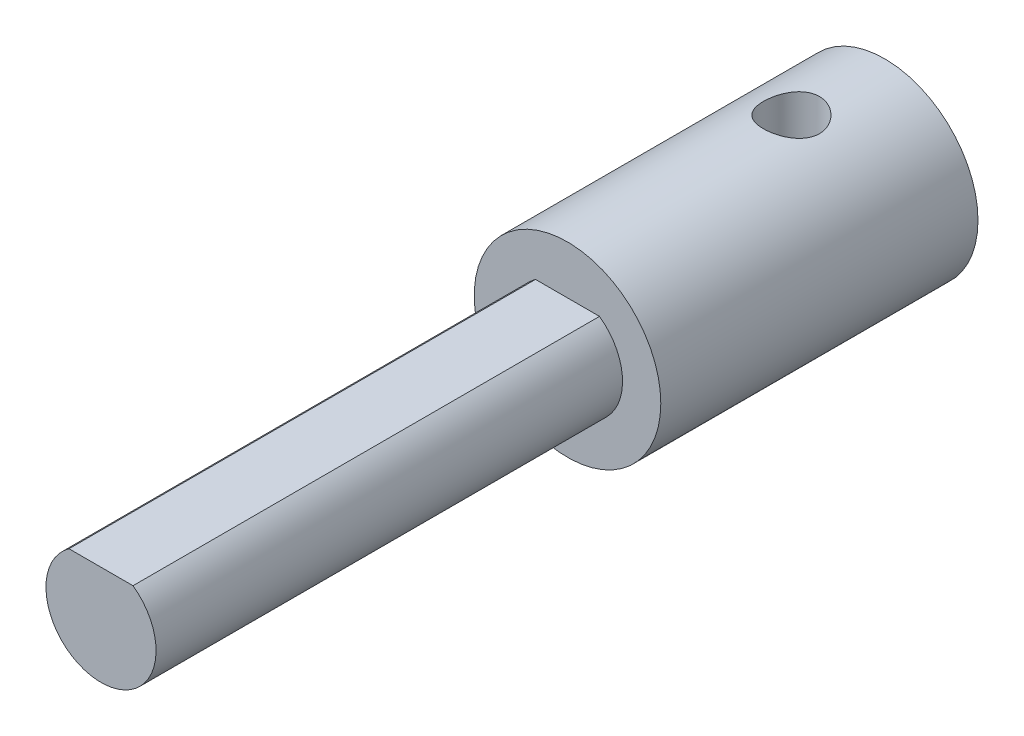
ISO-10303-21;
HEADER;
FILE_DESCRIPTION(('STEP AP214'),'2;1');
FILE_NAME('part.step','',(''),(''),'','','');
FILE_SCHEMA(('AUTOMOTIVE_DESIGN { 1 0 10303 214 1 1 1 1 }'));
ENDSEC;
DATA;
#1=APPLICATION_CONTEXT('core data for automotive mechanical design processes');
#2=APPLICATION_PROTOCOL_DEFINITION('international standard','automotive_design',2000,#1);
#3=PRODUCT_CONTEXT('',#1,'mechanical');
#4=PRODUCT('Part','Part','',(#3));
#5=PRODUCT_RELATED_PRODUCT_CATEGORY('part','',(#4));
#6=PRODUCT_DEFINITION_FORMATION('','',#4);
#7=PRODUCT_DEFINITION_CONTEXT('part definition',#1,'design');
#8=PRODUCT_DEFINITION('design','',#6,#7);
#9=PRODUCT_DEFINITION_SHAPE('','',#8);
#10=(LENGTH_UNIT() NAMED_UNIT(*) SI_UNIT(.MILLI.,.METRE.));
#11=(NAMED_UNIT(*) PLANE_ANGLE_UNIT() SI_UNIT($,.RADIAN.));
#12=(NAMED_UNIT(*) SI_UNIT($,.STERADIAN.) SOLID_ANGLE_UNIT());
#13=UNCERTAINTY_MEASURE_WITH_UNIT(LENGTH_MEASURE(1.E-05),#10,'distance_accuracy_value','');
#14=(GEOMETRIC_REPRESENTATION_CONTEXT(3) GLOBAL_UNCERTAINTY_ASSIGNED_CONTEXT((#13)) GLOBAL_UNIT_ASSIGNED_CONTEXT((#10,
#11,#12)) REPRESENTATION_CONTEXT('',''));
#15=CARTESIAN_POINT('',(0.,0.,0.));
#16=DIRECTION('',(0.,0.,1.));
#17=DIRECTION('',(1.,0.,0.));
#18=AXIS2_PLACEMENT_3D('',#15,#16,#17);
#19=CARTESIAN_POINT('',(0.,0.,17.));
#20=DIRECTION('',(0.,0.,1.));
#21=DIRECTION('',(1.,0.,0.));
#22=AXIS2_PLACEMENT_3D('',#19,#20,#21);
#23=PLANE('',#22);
#24=CARTESIAN_POINT('',(0.,0.,17.));
#25=DIRECTION('',(0.,0.,1.));
#26=DIRECTION('',(1.,0.,0.));
#27=AXIS2_PLACEMENT_3D('',#24,#25,#26);
#28=CIRCLE('',#27,5.);
#29=CARTESIAN_POINT('',(5.,0.,17.));
#30=VERTEX_POINT('',#29);
#31=EDGE_CURVE('E108',#30,#30,#28,.T.);
#32=ORIENTED_EDGE('',*,*,#31,.T.);
#33=EDGE_LOOP('',(#32));
#34=FACE_BOUND('',#33,.T.);
#35=CARTESIAN_POINT('',(0.,0.,17.));
#36=DIRECTION('',(0.,0.,1.));
#37=DIRECTION('',(1.,0.,0.));
#38=AXIS2_PLACEMENT_3D('',#35,#36,#37);
#39=CIRCLE('',#38,2.95);
#40=CARTESIAN_POINT('',(-1.71537167984084,2.4,17.));
#41=VERTEX_POINT('',#40);
#42=CARTESIAN_POINT('',(1.71537167984084,2.4,17.));
#43=VERTEX_POINT('',#42);
#44=EDGE_CURVE('E57',#41,#43,#39,.T.);
#45=ORIENTED_EDGE('',*,*,#44,.F.);
#46=DIRECTION('',(1.,0.,0.));
#47=VECTOR('',#46,1.);
#48=CARTESIAN_POINT('',(0.,2.4,17.));
#49=LINE('',#48,#47);
#50=EDGE_CURVE('E91',#41,#43,#49,.T.);
#51=ORIENTED_EDGE('',*,*,#50,.T.);
#52=EDGE_LOOP('',(#45,#51));
#53=FACE_BOUND('',#52,.T.);
#54=ADVANCED_FACE('F43',(#34,#53),#23,.T.);
#55=CARTESIAN_POINT('',(0.,0.,15.));
#56=DIRECTION('',(0.,0.,-1.));
#57=DIRECTION('',(-1.,0.,0.));
#58=AXIS2_PLACEMENT_3D('',#55,#56,#57);
#59=CYLINDRICAL_SURFACE('',#58,5.);
#60=CARTESIAN_POINT('',(0.,0.,0.));
#61=DIRECTION('',(0.,0.,1.));
#62=DIRECTION('',(1.,0.,0.));
#63=AXIS2_PLACEMENT_3D('',#60,#61,#62);
#64=CIRCLE('',#63,5.);
#65=CARTESIAN_POINT('',(5.,0.,0.));
#66=VERTEX_POINT('',#65);
#67=EDGE_CURVE('E221',#66,#66,#64,.T.);
#68=ORIENTED_EDGE('',*,*,#67,.T.);
#69=EDGE_LOOP('',(#68));
#70=FACE_BOUND('',#69,.T.);
#71=CARTESIAN_POINT('',(0.,5.,3.5));
#72=CARTESIAN_POINT('',(0.0822886127532999,4.9999992925055,3.50000099748489));
#73=CARTESIAN_POINT('',(0.164587318351529,4.99794915693954,3.50679386362397));
#74=CARTESIAN_POINT('',(0.326788125304881,4.98997105593691,3.5337213542221));
#75=CARTESIAN_POINT('',(0.40668950441142,4.98404193389692,3.55385995802334));
#76=CARTESIAN_POINT('',(0.561732707754526,4.96895552501836,3.60674601691026));
#77=CARTESIAN_POINT('',(0.636881364395373,4.95980300250425,3.63947486961894));
#78=CARTESIAN_POINT('',(0.780624181053131,4.93922109237645,3.71653609305584));
#79=CARTESIAN_POINT('',(0.84921746746967,4.92779140192067,3.76087000739542));
#80=CARTESIAN_POINT('',(0.979871797183745,4.90350737192774,3.86122400747267));
#81=CARTESIAN_POINT('',(1.04171807124434,4.89062383657036,3.91751662588591));
#82=CARTESIAN_POINT('',(1.15524920923324,4.86505834210442,4.03960922991018));
#83=CARTESIAN_POINT('',(1.20693236327441,4.85237641724501,4.10541081212496));
#84=CARTESIAN_POINT('',(1.29980037723708,4.82834113993772,4.24647075303761));
#85=CARTESIAN_POINT('',(1.34072309022213,4.81702406663875,4.32190846099074));
#86=CARTESIAN_POINT('',(1.4092139477476,4.79743620394031,4.47898925423029));
#87=CARTESIAN_POINT('',(1.43678529919973,4.78916468313311,4.56063084392798));
#88=CARTESIAN_POINT('',(1.47701633682652,4.77690870838434,4.72539026613046));
#89=CARTESIAN_POINT('',(1.49007196234677,4.77281069324533,4.80840274386394));
#90=CARTESIAN_POINT('',(1.50213730614672,4.76902789749767,4.97553315621677));
#91=CARTESIAN_POINT('',(1.50115042761078,4.76934204760571,5.05965081805909));
#92=CARTESIAN_POINT('',(1.48546977199812,4.77424744067778,5.22338390860848));
#93=CARTESIAN_POINT('',(1.47127205262685,4.7786838859914,5.30305225036224));
#94=CARTESIAN_POINT('',(1.43037420427056,4.79108356228624,5.45881978627346));
#95=CARTESIAN_POINT('',(1.40367284141641,4.79904714132351,5.53491862737433));
#96=CARTESIAN_POINT('',(1.33816026653682,4.81772733074973,5.68260034966074));
#97=CARTESIAN_POINT('',(1.29918816934642,4.82848016115952,5.75410708395526));
#98=CARTESIAN_POINT('',(1.21035222588683,4.85150987000065,5.88973202201019));
#99=CARTESIAN_POINT('',(1.16048574002588,4.86378711746991,5.95384842941378));
#100=CARTESIAN_POINT('',(1.04881290765546,4.88911011297937,6.07568619076202));
#101=CARTESIAN_POINT('',(0.986594907466971,4.90216654310498,6.13302866402967));
#102=CARTESIAN_POINT('',(0.853263259313966,4.92712244063259,6.23655398406425));
#103=CARTESIAN_POINT('',(0.782149051860887,4.9390218351841,6.28273612841443));
#104=CARTESIAN_POINT('',(0.632355038342802,4.9604316006947,6.36285992246473));
#105=CARTESIAN_POINT('',(0.553627749747949,4.96992543668314,6.39671751624986));
#106=CARTESIAN_POINT('',(0.391245415603518,4.98533521832222,6.45059959009963));
#107=CARTESIAN_POINT('',(0.307591751589581,4.99125216186999,6.47062792853249));
#108=CARTESIAN_POINT('',(0.140952242668331,4.99868364643538,6.4956521778994));
#109=CARTESIAN_POINT('',(0.058050097601186,5.0003485041779,6.50116158580161));
#110=CARTESIAN_POINT('',(-0.107499605823384,4.9995292324176,6.49843084428792));
#111=CARTESIAN_POINT('',(-0.190147196690782,4.99704565677756,6.49019253034856));
#112=CARTESIAN_POINT('',(-0.350903605309698,4.98830696987163,6.4606153888885));
#113=CARTESIAN_POINT('',(-0.42907277261417,4.98213829799417,6.43957661241913));
#114=CARTESIAN_POINT('',(-0.580754638954522,4.96674347841533,6.3853567672218));
#115=CARTESIAN_POINT('',(-0.654266777025584,4.95751696321085,6.35217423896214));
#116=CARTESIAN_POINT('',(-0.796437189461053,4.93669654351325,6.27374683451887));
#117=CARTESIAN_POINT('',(-0.86494382619967,4.92505280829675,6.22824065905203));
#118=CARTESIAN_POINT('',(-0.993523307980148,4.90073468764318,6.12677524594719));
#119=CARTESIAN_POINT('',(-1.05359403235594,4.8880600443108,6.07081338811233));
#120=CARTESIAN_POINT('',(-1.16585744551027,4.86253171869138,5.94761269163065));
#121=CARTESIAN_POINT('',(-1.21768481231504,4.84968825033268,5.88003812422826));
#122=CARTESIAN_POINT('',(-1.30928995072154,4.82576515238464,5.73687206098647));
#123=CARTESIAN_POINT('',(-1.34906803829472,4.81468547654651,5.66128077544179));
#124=CARTESIAN_POINT('',(-1.41517347127168,4.79567189615055,5.50446750874531));
#125=CARTESIAN_POINT('',(-1.4415634693705,4.78772337843827,5.42327381346341));
#126=CARTESIAN_POINT('',(-1.48021730815114,4.77591594362794,5.25731203106852));
#127=CARTESIAN_POINT('',(-1.49248598978779,4.772055625083,5.17254517921233));
#128=CARTESIAN_POINT('',(-1.50221984485059,4.76899972496087,5.00563848162377));
#129=CARTESIAN_POINT('',(-1.5002805530849,4.76961647442754,4.92353634898241));
#130=CARTESIAN_POINT('',(-1.48307505444813,4.77499401288294,4.7608858966272));
#131=CARTESIAN_POINT('',(-1.46780938124716,4.77975463592551,4.68033751482365));
#132=CARTESIAN_POINT('',(-1.42476888804136,4.79275763670386,4.52405460085715));
#133=CARTESIAN_POINT('',(-1.39715175507068,4.80095604545965,4.44827271263831));
#134=CARTESIAN_POINT('',(-1.33031507121129,4.81990278909136,4.30235756118227));
#135=CARTESIAN_POINT('',(-1.29109329962876,4.83065161194312,4.23222538235924));
#136=CARTESIAN_POINT('',(-1.20048763805072,4.85397676425833,4.09683688347289));
#137=CARTESIAN_POINT('',(-1.14871276092994,4.86660540163798,4.03185123873959));
#138=CARTESIAN_POINT('',(-1.03517434629782,4.89201320450026,3.91129750169214));
#139=CARTESIAN_POINT('',(-0.973408217134501,4.90479240823905,3.85573186053224));
#140=CARTESIAN_POINT('',(-0.839465762183248,4.92950936570649,3.75397658770497));
#141=CARTESIAN_POINT('',(-0.767037885790607,4.94141159765674,3.70810855314451));
#142=CARTESIAN_POINT('',(-0.615141373983529,4.96260680455813,3.62926483009597));
#143=CARTESIAN_POINT('',(-0.535676052998954,4.97190099931067,3.59628311172549));
#144=CARTESIAN_POINT('',(-0.380757712655281,4.98602174969301,3.54710472434725));
#145=CARTESIAN_POINT('',(-0.305786961954234,4.99122027381068,3.52948832711675));
#146=CARTESIAN_POINT('',(-0.15388019523078,4.99820944494492,3.50593647475842));
#147=CARTESIAN_POINT('',(-0.0769445098581396,5.0000006615474,3.49999906729518));
#148=CARTESIAN_POINT('',(0.,5.,3.5));
#149=B_SPLINE_CURVE_WITH_KNOTS('',3,(#71,#72,#73,#74,#75,#76,#77,#78,#79,#80,#81,#82,#83,#84,
#85,#86,#87,#88,#89,#90,#91,#92,#93,#94,#95,#96,#97,#98,#99,#100,#101,#102,#103,#104,#105,#106,
#107,#108,#109,#110,#111,#112,#113,#114,#115,#116,#117,#118,#119,#120,#121,#122,#123,#124,#125,
#126,#127,#128,#129,#130,#131,#132,#133,#134,#135,#136,#137,#138,#139,#140,#141,#142,#143,#144,
#145,#146,#147,#148),.UNSPECIFIED.,.T.,.F.,(4,2,2,2,2,2,2,2,2,2,2,2,2,2,2,2,2,2,2,2,2,2,2,2,2,2,
2,2,2,2,2,2,2,2,2,2,2,2,4),(0.,0.246583203612611,0.493239964846,0.739533676300874,
0.985860164412702,1.23855602948191,1.49129437288633,1.74971481004109,2.00807314543224,
2.25919689356599,2.51025978319089,2.75226016697676,2.99428443658001,3.2396242644712,
3.48502360158556,3.74067104048167,3.99633456531072,4.25371046881689,4.51101453528808,
4.75908809438545,5.00712853550327,5.24956746682327,5.49203554593729,5.74011305702908,
5.98825282000191,6.24540400322818,6.5025484425268,6.75847814951252,7.01432009460283,
7.25950155466943,7.504673196616,7.74680040402721,7.98897397553107,8.23996925679931,
8.49102974897502,8.74942996156671,9.00770911595235,9.23831691930459,9.46888616948874),.UNSPECIFIED.);
#150=CARTESIAN_POINT('',(0.,5.,3.5));
#151=VERTEX_POINT('',#150);
#152=EDGE_CURVE('E111',#151,#151,#149,.T.);
#153=ORIENTED_EDGE('',*,*,#152,.T.);
#154=EDGE_LOOP('',(#153));
#155=FACE_BOUND('',#154,.T.);
#156=ORIENTED_EDGE('',*,*,#31,.F.);
#157=EDGE_LOOP('',(#156));
#158=FACE_BOUND('',#157,.T.);
#159=ADVANCED_FACE('F132',(#70,#155,#158),#59,.T.);
#160=CARTESIAN_POINT('',(0.,0.,15.));
#161=DIRECTION('',(0.,0.,-1.));
#162=DIRECTION('',(-1.,0.,0.));
#163=AXIS2_PLACEMENT_3D('',#160,#161,#162);
#164=CYLINDRICAL_SURFACE('',#163,3.125);
#165=CARTESIAN_POINT('',(0.,0.,0.));
#166=DIRECTION('',(0.,0.,1.));
#167=DIRECTION('',(1.,0.,0.));
#168=AXIS2_PLACEMENT_3D('',#165,#166,#167);
#169=CIRCLE('',#168,3.125);
#170=CARTESIAN_POINT('',(-1.65623820750519,2.65,0.));
#171=VERTEX_POINT('',#170);
#172=CARTESIAN_POINT('',(1.65623820750519,2.65,0.));
#173=VERTEX_POINT('',#172);
#174=EDGE_CURVE('E218',#171,#173,#169,.T.);
#175=ORIENTED_EDGE('',*,*,#174,.F.);
#176=DIRECTION('',(0.,0.,-1.));
#177=VECTOR('',#176,1.);
#178=CARTESIAN_POINT('',(-1.65623820750519,2.65,15.));
#179=LINE('',#178,#177);
#180=CARTESIAN_POINT('',(-1.65623820750519,2.65,15.));
#181=VERTEX_POINT('',#180);
#182=EDGE_CURVE('E11',#181,#171,#179,.T.);
#183=ORIENTED_EDGE('',*,*,#182,.F.);
#184=CARTESIAN_POINT('',(0.,0.,15.));
#185=DIRECTION('',(0.,0.,1.));
#186=DIRECTION('',(1.,0.,0.));
#187=AXIS2_PLACEMENT_3D('',#184,#185,#186);
#188=CIRCLE('',#187,3.125);
#189=CARTESIAN_POINT('',(1.65623820750519,2.65,15.));
#190=VERTEX_POINT('',#189);
#191=EDGE_CURVE('E77',#181,#190,#188,.T.);
#192=ORIENTED_EDGE('',*,*,#191,.T.);
#193=DIRECTION('',(0.,0.,-1.));
#194=VECTOR('',#193,1.);
#195=CARTESIAN_POINT('',(1.65623820750519,2.65,15.));
#196=LINE('',#195,#194);
#197=EDGE_CURVE('E51',#190,#173,#196,.T.);
#198=ORIENTED_EDGE('',*,*,#197,.T.);
#199=EDGE_LOOP('',(#175,#183,#192,#198));
#200=FACE_BOUND('',#199,.T.);
#201=ADVANCED_FACE('F45',(#200),#164,.F.);
#202=CARTESIAN_POINT('',(0.,2.65,15.));
#203=DIRECTION('',(0.,1.,0.));
#204=DIRECTION('',(0.,0.,1.));
#205=AXIS2_PLACEMENT_3D('',#202,#203,#204);
#206=PLANE('',#205);
#207=CARTESIAN_POINT('',(0.,2.65,5.));
#208=DIRECTION('',(0.,1.,0.));
#209=DIRECTION('',(0.,0.,1.));
#210=AXIS2_PLACEMENT_3D('',#207,#208,#209);
#211=CIRCLE('',#210,1.5);
#212=CARTESIAN_POINT('',(0.,2.65,6.5));
#213=VERTEX_POINT('',#212);
#214=EDGE_CURVE('E119',#213,#213,#211,.T.);
#215=ORIENTED_EDGE('',*,*,#214,.T.);
#216=EDGE_LOOP('',(#215));
#217=FACE_BOUND('',#216,.T.);
#218=DIRECTION('',(1.,0.,0.));
#219=VECTOR('',#218,1.);
#220=CARTESIAN_POINT('',(0.,2.65,0.));
#221=LINE('',#220,#219);
#222=EDGE_CURVE('E222',#171,#173,#221,.T.);
#223=ORIENTED_EDGE('',*,*,#222,.T.);
#224=ORIENTED_EDGE('',*,*,#197,.F.);
#225=DIRECTION('',(1.,0.,0.));
#226=VECTOR('',#225,1.);
#227=CARTESIAN_POINT('',(0.,2.65,15.));
#228=LINE('',#227,#226);
#229=EDGE_CURVE('E224',#181,#190,#228,.T.);
#230=ORIENTED_EDGE('',*,*,#229,.F.);
#231=ORIENTED_EDGE('',*,*,#182,.T.);
#232=EDGE_LOOP('',(#223,#224,#230,#231));
#233=FACE_BOUND('',#232,.T.);
#234=ADVANCED_FACE('F166',(#217,#233),#206,.F.);
#235=CARTESIAN_POINT('',(0.,0.,0.));
#236=DIRECTION('',(0.,0.,1.));
#237=DIRECTION('',(1.,0.,0.));
#238=AXIS2_PLACEMENT_3D('',#235,#236,#237);
#239=PLANE('',#238);
#240=ORIENTED_EDGE('',*,*,#174,.T.);
#241=ORIENTED_EDGE('',*,*,#222,.F.);
#242=EDGE_LOOP('',(#240,#241));
#243=FACE_BOUND('',#242,.T.);
#244=ORIENTED_EDGE('',*,*,#67,.F.);
#245=EDGE_LOOP('',(#244));
#246=FACE_BOUND('',#245,.T.);
#247=ADVANCED_FACE('F170',(#243,#246),#239,.F.);
#248=CARTESIAN_POINT('',(0.,5.001,5.));
#249=DIRECTION('',(0.,-1.,0.));
#250=DIRECTION('',(0.,0.,-1.));
#251=AXIS2_PLACEMENT_3D('',#248,#249,#250);
#252=CYLINDRICAL_SURFACE('',#251,1.5);
#253=ORIENTED_EDGE('',*,*,#152,.F.);
#254=EDGE_LOOP('',(#253));
#255=FACE_BOUND('',#254,.T.);
#256=ORIENTED_EDGE('',*,*,#214,.F.);
#257=EDGE_LOOP('',(#256));
#258=FACE_BOUND('',#257,.T.);
#259=ADVANCED_FACE('F121',(#255,#258),#252,.F.);
#260=CARTESIAN_POINT('',(0.,0.,15.));
#261=DIRECTION('',(0.,0.,1.));
#262=DIRECTION('',(1.,0.,0.));
#263=AXIS2_PLACEMENT_3D('',#260,#261,#262);
#264=PLANE('',#263);
#265=ORIENTED_EDGE('',*,*,#191,.F.);
#266=ORIENTED_EDGE('',*,*,#229,.T.);
#267=EDGE_LOOP('',(#265,#266));
#268=FACE_BOUND('',#267,.T.);
#269=ADVANCED_FACE('F126',(#268),#264,.F.);
#270=CARTESIAN_POINT('',(0.,2.4,42.));
#271=DIRECTION('',(0.,1.,0.));
#272=DIRECTION('',(0.,0.,1.));
#273=AXIS2_PLACEMENT_3D('',#270,#271,#272);
#274=PLANE('',#273);
#275=ORIENTED_EDGE('',*,*,#50,.F.);
#276=DIRECTION('',(0.,0.,-1.));
#277=VECTOR('',#276,1.);
#278=CARTESIAN_POINT('',(-1.71537167984084,2.4,42.));
#279=LINE('',#278,#277);
#280=CARTESIAN_POINT('',(-1.71537167984084,2.4,42.));
#281=VERTEX_POINT('',#280);
#282=EDGE_CURVE('E100',#281,#41,#279,.T.);
#283=ORIENTED_EDGE('',*,*,#282,.F.);
#284=DIRECTION('',(1.,0.,0.));
#285=VECTOR('',#284,1.);
#286=CARTESIAN_POINT('',(0.,2.4,42.));
#287=LINE('',#286,#285);
#288=CARTESIAN_POINT('',(1.71537167984084,2.4,42.));
#289=VERTEX_POINT('',#288);
#290=EDGE_CURVE('E98',#281,#289,#287,.T.);
#291=ORIENTED_EDGE('',*,*,#290,.T.);
#292=DIRECTION('',(0.,0.,-1.));
#293=VECTOR('',#292,1.);
#294=CARTESIAN_POINT('',(1.71537167984084,2.4,42.));
#295=LINE('',#294,#293);
#296=EDGE_CURVE('E96',#289,#43,#295,.T.);
#297=ORIENTED_EDGE('',*,*,#296,.T.);
#298=EDGE_LOOP('',(#275,#283,#291,#297));
#299=FACE_BOUND('',#298,.T.);
#300=ADVANCED_FACE('F97',(#299),#274,.T.);
#301=CARTESIAN_POINT('',(0.,0.,42.));
#302=DIRECTION('',(0.,0.,-1.));
#303=DIRECTION('',(-1.,0.,0.));
#304=AXIS2_PLACEMENT_3D('',#301,#302,#303);
#305=CYLINDRICAL_SURFACE('',#304,2.95);
#306=ORIENTED_EDGE('',*,*,#44,.T.);
#307=ORIENTED_EDGE('',*,*,#296,.F.);
#308=CARTESIAN_POINT('',(0.,0.,42.));
#309=DIRECTION('',(0.,0.,1.));
#310=DIRECTION('',(1.,0.,0.));
#311=AXIS2_PLACEMENT_3D('',#308,#309,#310);
#312=CIRCLE('',#311,2.95);
#313=EDGE_CURVE('E85',#281,#289,#312,.T.);
#314=ORIENTED_EDGE('',*,*,#313,.F.);
#315=ORIENTED_EDGE('',*,*,#282,.T.);
#316=EDGE_LOOP('',(#306,#307,#314,#315));
#317=FACE_BOUND('',#316,.T.);
#318=ADVANCED_FACE('F102',(#317),#305,.T.);
#319=CARTESIAN_POINT('',(0.,0.,42.));
#320=DIRECTION('',(0.,0.,1.));
#321=DIRECTION('',(1.,0.,0.));
#322=AXIS2_PLACEMENT_3D('',#319,#320,#321);
#323=PLANE('',#322);
#324=ORIENTED_EDGE('',*,*,#290,.F.);
#325=ORIENTED_EDGE('',*,*,#313,.T.);
#326=EDGE_LOOP('',(#324,#325));
#327=FACE_BOUND('',#326,.T.);
#328=ADVANCED_FACE('F138',(#327),#323,.T.);
#329=CLOSED_SHELL('',(#54,#159,#201,#234,#247,#259,#269,#300,#318,#328));
#330=MANIFOLD_SOLID_BREP('B2',#329);
#331=ADVANCED_BREP_SHAPE_REPRESENTATION('',(#18,#330),#14);
#332=SHAPE_DEFINITION_REPRESENTATION(#9,#331);
ENDSEC;
END-ISO-10303-21;
